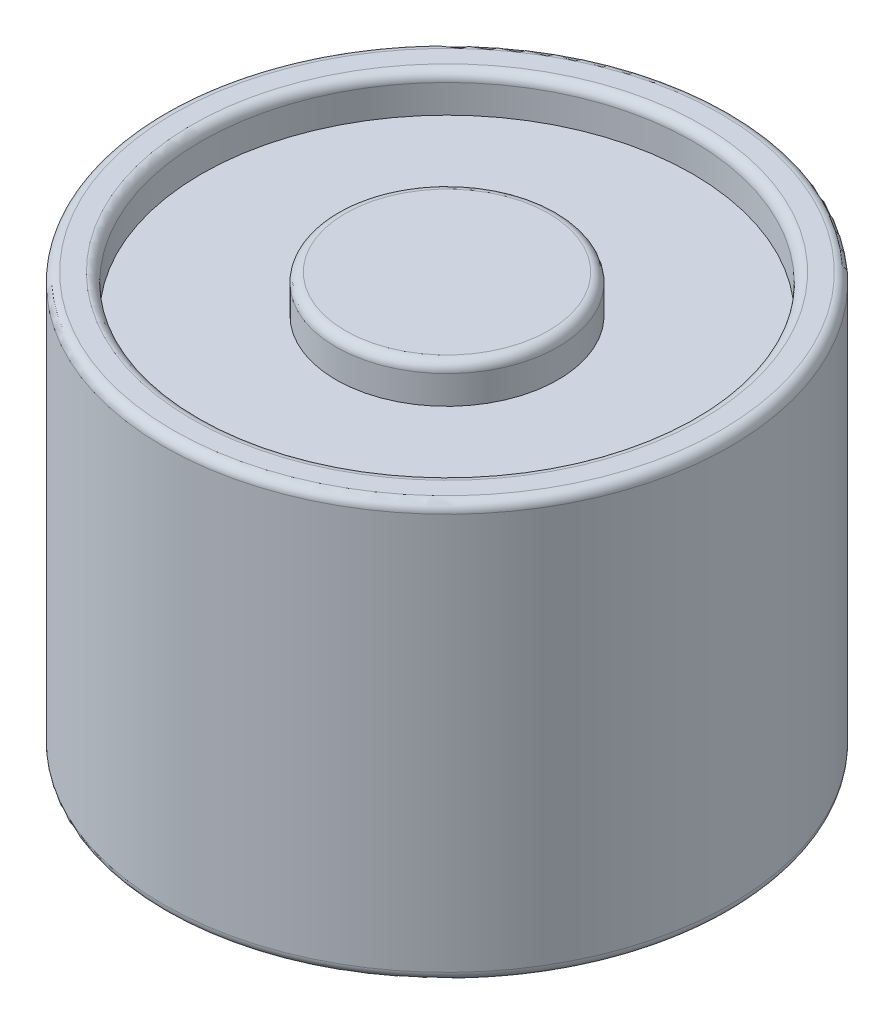
ISO-10303-21;
HEADER;
FILE_DESCRIPTION(('STEP AP214'),'2;1');
FILE_NAME('part.step','',(''),(''),'','','');
FILE_SCHEMA(('AUTOMOTIVE_DESIGN { 1 0 10303 214 1 1 1 1 }'));
ENDSEC;
DATA;
#1=APPLICATION_CONTEXT('core data for automotive mechanical design processes');
#2=APPLICATION_PROTOCOL_DEFINITION('international standard','automotive_design',2000,#1);
#3=PRODUCT_CONTEXT('',#1,'mechanical');
#4=PRODUCT('Part','Part','',(#3));
#5=PRODUCT_RELATED_PRODUCT_CATEGORY('part','',(#4));
#6=PRODUCT_DEFINITION_FORMATION('','',#4);
#7=PRODUCT_DEFINITION_CONTEXT('part definition',#1,'design');
#8=PRODUCT_DEFINITION('design','',#6,#7);
#9=PRODUCT_DEFINITION_SHAPE('','',#8);
#10=(LENGTH_UNIT() NAMED_UNIT(*) SI_UNIT(.MILLI.,.METRE.));
#11=(NAMED_UNIT(*) PLANE_ANGLE_UNIT() SI_UNIT($,.RADIAN.));
#12=(NAMED_UNIT(*) SI_UNIT($,.STERADIAN.) SOLID_ANGLE_UNIT());
#13=UNCERTAINTY_MEASURE_WITH_UNIT(LENGTH_MEASURE(1.E-05),#10,'distance_accuracy_value','');
#14=(GEOMETRIC_REPRESENTATION_CONTEXT(3) GLOBAL_UNCERTAINTY_ASSIGNED_CONTEXT((#13)) GLOBAL_UNIT_ASSIGNED_CONTEXT((#10,
#11,#12)) REPRESENTATION_CONTEXT('',''));
#15=CARTESIAN_POINT('',(0.,0.,0.));
#16=DIRECTION('',(0.,0.,1.));
#17=DIRECTION('',(1.,0.,0.));
#18=AXIS2_PLACEMENT_3D('',#15,#16,#17);
#19=CARTESIAN_POINT('',(0.,22.,0.));
#20=DIRECTION('',(0.,-1.,0.));
#21=DIRECTION('',(0.,0.,-1.));
#22=AXIS2_PLACEMENT_3D('',#19,#20,#21);
#23=CYLINDRICAL_SURFACE('',#22,15.);
#24=CARTESIAN_POINT('',(0.,0.5,0.));
#25=DIRECTION('',(0.,1.,0.));
#26=DIRECTION('',(0.,0.,1.));
#27=AXIS2_PLACEMENT_3D('',#24,#25,#26);
#28=CIRCLE('',#27,15.);
#29=CARTESIAN_POINT('',(0.,0.5,15.));
#30=VERTEX_POINT('',#29);
#31=EDGE_CURVE('E61',#30,#30,#28,.T.);
#32=ORIENTED_EDGE('',*,*,#31,.T.);
#33=EDGE_LOOP('',(#32));
#34=FACE_BOUND('',#33,.T.);
#35=CARTESIAN_POINT('',(0.,21.5,0.));
#36=DIRECTION('',(0.,1.,0.));
#37=DIRECTION('',(0.,0.,1.));
#38=AXIS2_PLACEMENT_3D('',#35,#36,#37);
#39=CIRCLE('',#38,15.);
#40=CARTESIAN_POINT('',(0.,21.5,15.));
#41=VERTEX_POINT('',#40);
#42=EDGE_CURVE('E65',#41,#41,#39,.F.);
#43=ORIENTED_EDGE('',*,*,#42,.T.);
#44=EDGE_LOOP('',(#43));
#45=FACE_BOUND('',#44,.T.);
#46=ADVANCED_FACE('F37',(#34,#45),#23,.T.);
#47=CARTESIAN_POINT('',(0.,22.,0.));
#48=DIRECTION('',(0.,1.,0.));
#49=DIRECTION('',(0.,0.,1.));
#50=AXIS2_PLACEMENT_3D('',#47,#48,#49);
#51=PLANE('',#50);
#52=CARTESIAN_POINT('',(0.,22.,0.));
#53=DIRECTION('',(0.,1.,0.));
#54=DIRECTION('',(0.,0.,1.));
#55=AXIS2_PLACEMENT_3D('',#52,#53,#54);
#56=CIRCLE('',#55,13.5);
#57=CARTESIAN_POINT('',(0.,22.,13.5));
#58=VERTEX_POINT('',#57);
#59=EDGE_CURVE('E10',#58,#58,#56,.F.);
#60=ORIENTED_EDGE('',*,*,#59,.T.);
#61=EDGE_LOOP('',(#60));
#62=FACE_BOUND('',#61,.T.);
#63=CARTESIAN_POINT('',(0.,22.,0.));
#64=DIRECTION('',(0.,1.,0.));
#65=DIRECTION('',(0.,0.,1.));
#66=AXIS2_PLACEMENT_3D('',#63,#64,#65);
#67=CIRCLE('',#66,14.5);
#68=CARTESIAN_POINT('',(0.,22.,14.5));
#69=VERTEX_POINT('',#68);
#70=EDGE_CURVE('E45',#69,#69,#67,.T.);
#71=ORIENTED_EDGE('',*,*,#70,.T.);
#72=EDGE_LOOP('',(#71));
#73=FACE_BOUND('',#72,.T.);
#74=ADVANCED_FACE('F102',(#62,#73),#51,.T.);
#75=CARTESIAN_POINT('',(0.,0.,0.));
#76=DIRECTION('',(0.,1.,0.));
#77=DIRECTION('',(0.,0.,1.));
#78=AXIS2_PLACEMENT_3D('',#75,#76,#77);
#79=PLANE('',#78);
#80=CARTESIAN_POINT('',(0.,0.,0.));
#81=DIRECTION('',(0.,1.,0.));
#82=DIRECTION('',(0.,0.,1.));
#83=AXIS2_PLACEMENT_3D('',#80,#81,#82);
#84=CIRCLE('',#83,14.5);
#85=CARTESIAN_POINT('',(0.,0.,14.5));
#86=VERTEX_POINT('',#85);
#87=EDGE_CURVE('E55',#86,#86,#84,.F.);
#88=ORIENTED_EDGE('',*,*,#87,.T.);
#89=EDGE_LOOP('',(#88));
#90=FACE_BOUND('',#89,.T.);
#91=ADVANCED_FACE('F96',(#90),#79,.F.);
#92=CARTESIAN_POINT('',(0.,20.,0.));
#93=DIRECTION('',(0.,1.,0.));
#94=DIRECTION('',(0.,0.,1.));
#95=AXIS2_PLACEMENT_3D('',#92,#93,#94);
#96=CYLINDRICAL_SURFACE('',#95,13.);
#97=CARTESIAN_POINT('',(0.,21.5,0.));
#98=DIRECTION('',(0.,1.,0.));
#99=DIRECTION('',(0.,0.,1.));
#100=AXIS2_PLACEMENT_3D('',#97,#98,#99);
#101=CIRCLE('',#100,13.);
#102=CARTESIAN_POINT('',(0.,21.5,13.));
#103=VERTEX_POINT('',#102);
#104=EDGE_CURVE('E50',#103,#103,#101,.T.);
#105=ORIENTED_EDGE('',*,*,#104,.T.);
#106=EDGE_LOOP('',(#105));
#107=FACE_BOUND('',#106,.T.);
#108=CARTESIAN_POINT('',(0.,20.,0.));
#109=DIRECTION('',(0.,1.,0.));
#110=DIRECTION('',(0.,0.,1.));
#111=AXIS2_PLACEMENT_3D('',#108,#109,#110);
#112=CIRCLE('',#111,13.);
#113=CARTESIAN_POINT('',(0.,20.,13.));
#114=VERTEX_POINT('',#113);
#115=EDGE_CURVE('E77',#114,#114,#112,.T.);
#116=ORIENTED_EDGE('',*,*,#115,.F.);
#117=EDGE_LOOP('',(#116));
#118=FACE_BOUND('',#117,.T.);
#119=ADVANCED_FACE('F91',(#107,#118),#96,.F.);
#120=CARTESIAN_POINT('',(0.,20.,0.));
#121=DIRECTION('',(0.,1.,0.));
#122=DIRECTION('',(0.,0.,1.));
#123=AXIS2_PLACEMENT_3D('',#120,#121,#122);
#124=PLANE('',#123);
#125=CARTESIAN_POINT('',(0.,20.,0.));
#126=DIRECTION('',(0.,1.,0.));
#127=DIRECTION('',(0.,0.,1.));
#128=AXIS2_PLACEMENT_3D('',#125,#126,#127);
#129=CIRCLE('',#128,5.88031104041955);
#130=CARTESIAN_POINT('',(0.,20.,5.88031104041955));
#131=VERTEX_POINT('',#130);
#132=EDGE_CURVE('E81',#131,#131,#129,.T.);
#133=ORIENTED_EDGE('',*,*,#132,.F.);
#134=EDGE_LOOP('',(#133));
#135=FACE_BOUND('',#134,.T.);
#136=ORIENTED_EDGE('',*,*,#115,.T.);
#137=EDGE_LOOP('',(#136));
#138=FACE_BOUND('',#137,.T.);
#139=ADVANCED_FACE('F88',(#135,#138),#124,.T.);
#140=CARTESIAN_POINT('',(0.,20.,0.));
#141=DIRECTION('',(0.,1.,0.));
#142=DIRECTION('',(0.,0.,1.));
#143=AXIS2_PLACEMENT_3D('',#140,#141,#142);
#144=CYLINDRICAL_SURFACE('',#143,5.88031104041955);
#145=CARTESIAN_POINT('',(0.,21.5,0.));
#146=DIRECTION('',(0.,1.,0.));
#147=DIRECTION('',(0.,0.,1.));
#148=AXIS2_PLACEMENT_3D('',#145,#146,#147);
#149=CIRCLE('',#148,5.88031104041955);
#150=CARTESIAN_POINT('',(0.,21.5,5.88031104041955));
#151=VERTEX_POINT('',#150);
#152=EDGE_CURVE('E69',#151,#151,#149,.F.);
#153=ORIENTED_EDGE('',*,*,#152,.T.);
#154=EDGE_LOOP('',(#153));
#155=FACE_BOUND('',#154,.T.);
#156=ORIENTED_EDGE('',*,*,#132,.T.);
#157=EDGE_LOOP('',(#156));
#158=FACE_BOUND('',#157,.T.);
#159=ADVANCED_FACE('F86',(#155,#158),#144,.T.);
#160=CARTESIAN_POINT('',(0.,22.,0.));
#161=DIRECTION('',(0.,1.,0.));
#162=DIRECTION('',(0.,0.,1.));
#163=AXIS2_PLACEMENT_3D('',#160,#161,#162);
#164=CIRCLE('',#163,5.38031104041955);
#165=CARTESIAN_POINT('',(0.,22.,5.38031104041955));
#166=VERTEX_POINT('',#165);
#167=EDGE_CURVE('E73',#166,#166,#164,.T.);
#168=ORIENTED_EDGE('',*,*,#167,.T.);
#169=EDGE_LOOP('',(#168));
#170=FACE_BOUND('',#169,.T.);
#171=ADVANCED_FACE('F112',(#170),#51,.T.);
#172=CARTESIAN_POINT('',(0.,21.5,0.));
#173=DIRECTION('',(0.,1.,0.));
#174=DIRECTION('',(0.,0.,1.));
#175=AXIS2_PLACEMENT_3D('',#172,#173,#174);
#176=TOROIDAL_SURFACE('',#175,5.38031104041955,0.5);
#177=ORIENTED_EDGE('',*,*,#152,.F.);
#178=EDGE_LOOP('',(#177));
#179=FACE_BOUND('',#178,.T.);
#180=ORIENTED_EDGE('',*,*,#167,.F.);
#181=EDGE_LOOP('',(#180));
#182=FACE_BOUND('',#181,.T.);
#183=ADVANCED_FACE('F115',(#179,#182),#176,.T.);
#184=CARTESIAN_POINT('',(0.,0.5,0.));
#185=DIRECTION('',(0.,1.,0.));
#186=DIRECTION('',(0.,0.,1.));
#187=AXIS2_PLACEMENT_3D('',#184,#185,#186);
#188=TOROIDAL_SURFACE('',#187,14.5,0.5);
#189=ORIENTED_EDGE('',*,*,#87,.F.);
#190=EDGE_LOOP('',(#189));
#191=FACE_BOUND('',#190,.T.);
#192=ORIENTED_EDGE('',*,*,#31,.F.);
#193=EDGE_LOOP('',(#192));
#194=FACE_BOUND('',#193,.T.);
#195=ADVANCED_FACE('F118',(#191,#194),#188,.T.);
#196=CARTESIAN_POINT('',(0.,21.5,0.));
#197=DIRECTION('',(0.,1.,0.));
#198=DIRECTION('',(0.,0.,1.));
#199=AXIS2_PLACEMENT_3D('',#196,#197,#198);
#200=TOROIDAL_SURFACE('',#199,13.5,0.5);
#201=ORIENTED_EDGE('',*,*,#59,.F.);
#202=EDGE_LOOP('',(#201));
#203=FACE_BOUND('',#202,.T.);
#204=ORIENTED_EDGE('',*,*,#104,.F.);
#205=EDGE_LOOP('',(#204));
#206=FACE_BOUND('',#205,.T.);
#207=ADVANCED_FACE('F121',(#203,#206),#200,.T.);
#208=CARTESIAN_POINT('',(0.,21.5,0.));
#209=DIRECTION('',(0.,1.,0.));
#210=DIRECTION('',(0.,0.,1.));
#211=AXIS2_PLACEMENT_3D('',#208,#209,#210);
#212=TOROIDAL_SURFACE('',#211,14.5,0.5);
#213=ORIENTED_EDGE('',*,*,#42,.F.);
#214=EDGE_LOOP('',(#213));
#215=FACE_BOUND('',#214,.T.);
#216=ORIENTED_EDGE('',*,*,#70,.F.);
#217=EDGE_LOOP('',(#216));
#218=FACE_BOUND('',#217,.T.);
#219=ADVANCED_FACE('F39',(#215,#218),#212,.T.);
#220=CLOSED_SHELL('',(#46,#74,#91,#119,#139,#159,#171,#183,#195,#207,#219));
#221=MANIFOLD_SOLID_BREP('B2',#220);
#222=ADVANCED_BREP_SHAPE_REPRESENTATION('',(#18,#221),#14);
#223=SHAPE_DEFINITION_REPRESENTATION(#9,#222);
ENDSEC;
END-ISO-10303-21;
